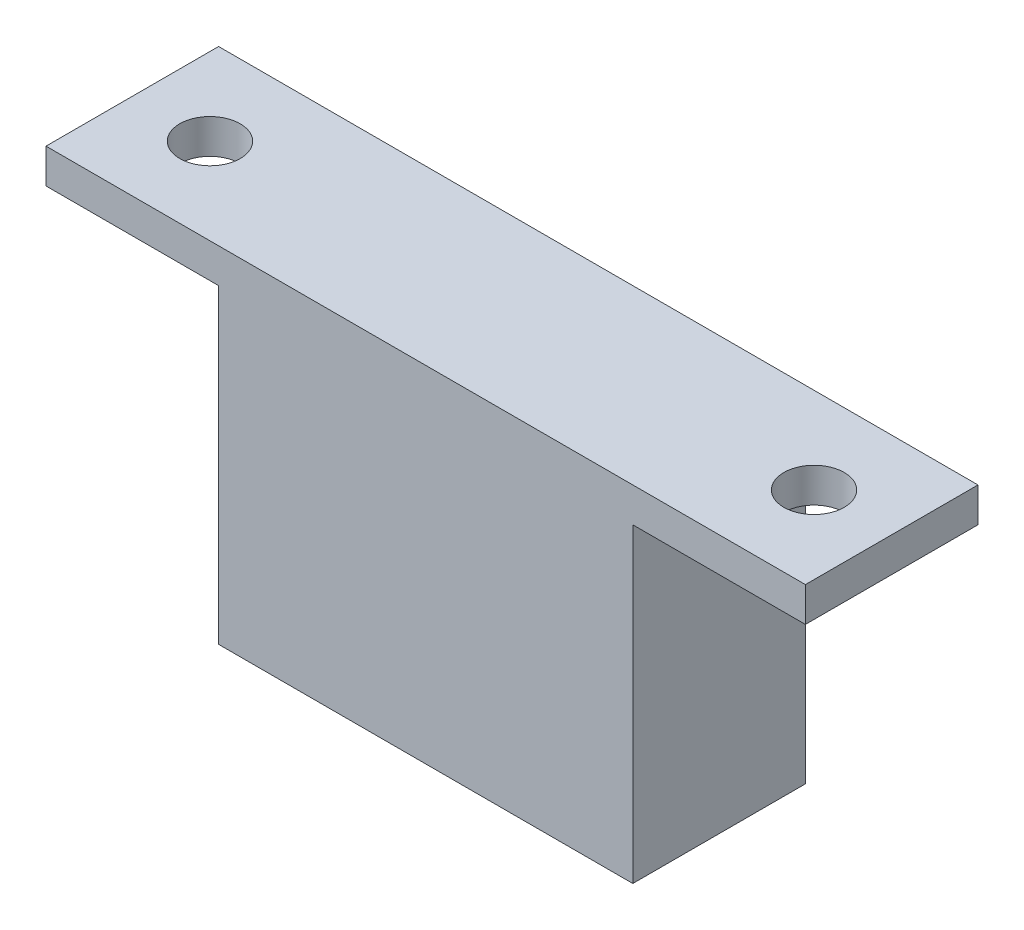
ISO-10303-21;
HEADER;
FILE_DESCRIPTION(('STEP AP214'),'2;1');
FILE_NAME('part.step','',(''),(''),'','','');
FILE_SCHEMA(('AUTOMOTIVE_DESIGN { 1 0 10303 214 1 1 1 1 }'));
ENDSEC;
DATA;
#1=APPLICATION_CONTEXT('core data for automotive mechanical design processes');
#2=APPLICATION_PROTOCOL_DEFINITION('international standard','automotive_design',2000,#1);
#3=PRODUCT_CONTEXT('',#1,'mechanical');
#4=PRODUCT('Part','Part','',(#3));
#5=PRODUCT_RELATED_PRODUCT_CATEGORY('part','',(#4));
#6=PRODUCT_DEFINITION_FORMATION('','',#4);
#7=PRODUCT_DEFINITION_CONTEXT('part definition',#1,'design');
#8=PRODUCT_DEFINITION('design','',#6,#7);
#9=PRODUCT_DEFINITION_SHAPE('','',#8);
#10=(LENGTH_UNIT() NAMED_UNIT(*) SI_UNIT(.MILLI.,.METRE.));
#11=(NAMED_UNIT(*) PLANE_ANGLE_UNIT() SI_UNIT($,.RADIAN.));
#12=(NAMED_UNIT(*) SI_UNIT($,.STERADIAN.) SOLID_ANGLE_UNIT());
#13=UNCERTAINTY_MEASURE_WITH_UNIT(LENGTH_MEASURE(1.E-05),#10,'distance_accuracy_value','');
#14=(GEOMETRIC_REPRESENTATION_CONTEXT(3) GLOBAL_UNCERTAINTY_ASSIGNED_CONTEXT((#13)) GLOBAL_UNIT_ASSIGNED_CONTEXT((#10,
#11,#12)) REPRESENTATION_CONTEXT('',''));
#15=CARTESIAN_POINT('',(0.,0.,0.));
#16=DIRECTION('',(0.,0.,1.));
#17=DIRECTION('',(1.,0.,0.));
#18=AXIS2_PLACEMENT_3D('',#15,#16,#17);
#19=CARTESIAN_POINT('',(12.,3.,10.));
#20=DIRECTION('',(-1.,0.,0.));
#21=DIRECTION('',(0.,-1.,0.));
#22=AXIS2_PLACEMENT_3D('',#19,#20,#21);
#23=PLANE('',#22);
#24=DIRECTION('',(0.,1.,0.));
#25=VECTOR('',#24,1.);
#26=CARTESIAN_POINT('',(12.,3.,0.));
#27=LINE('',#26,#25);
#28=CARTESIAN_POINT('',(12.,-15.,0.));
#29=VERTEX_POINT('',#28);
#30=CARTESIAN_POINT('',(12.,3.,0.));
#31=VERTEX_POINT('',#30);
#32=EDGE_CURVE('E130',#29,#31,#27,.T.);
#33=ORIENTED_EDGE('',*,*,#32,.T.);
#34=DIRECTION('',(0.,0.,-1.));
#35=VECTOR('',#34,1.);
#36=CARTESIAN_POINT('',(12.,3.,10.));
#37=LINE('',#36,#35);
#38=CARTESIAN_POINT('',(12.,3.,10.));
#39=VERTEX_POINT('',#38);
#40=EDGE_CURVE('E11',#39,#31,#37,.T.);
#41=ORIENTED_EDGE('',*,*,#40,.F.);
#42=DIRECTION('',(0.,1.,0.));
#43=VECTOR('',#42,1.);
#44=CARTESIAN_POINT('',(12.,3.,10.));
#45=LINE('',#44,#43);
#46=CARTESIAN_POINT('',(12.,-15.,10.));
#47=VERTEX_POINT('',#46);
#48=EDGE_CURVE('E145',#47,#39,#45,.T.);
#49=ORIENTED_EDGE('',*,*,#48,.F.);
#50=DIRECTION('',(0.,0.,-1.));
#51=VECTOR('',#50,1.);
#52=CARTESIAN_POINT('',(12.,-15.,10.));
#53=LINE('',#52,#51);
#54=EDGE_CURVE('E126',#47,#29,#53,.T.);
#55=ORIENTED_EDGE('',*,*,#54,.T.);
#56=EDGE_LOOP('',(#33,#41,#49,#55));
#57=FACE_BOUND('',#56,.T.);
#58=ADVANCED_FACE('F33',(#57),#23,.F.);
#59=CARTESIAN_POINT('',(22.,3.,10.));
#60=DIRECTION('',(0.,1.,0.));
#61=DIRECTION('',(-1.,0.,0.));
#62=AXIS2_PLACEMENT_3D('',#59,#60,#61);
#63=PLANE('',#62);
#64=CARTESIAN_POINT('',(17.5,3.,5.));
#65=DIRECTION('',(0.,1.,0.));
#66=DIRECTION('',(-1.,0.,0.));
#67=AXIS2_PLACEMENT_3D('',#64,#65,#66);
#68=CIRCLE('',#67,1.75);
#69=CARTESIAN_POINT('',(15.75,3.,5.));
#70=VERTEX_POINT('',#69);
#71=EDGE_CURVE('E181',#70,#70,#68,.T.);
#72=ORIENTED_EDGE('',*,*,#71,.T.);
#73=EDGE_LOOP('',(#72));
#74=FACE_BOUND('',#73,.T.);
#75=DIRECTION('',(1.,0.,0.));
#76=VECTOR('',#75,1.);
#77=CARTESIAN_POINT('',(22.,3.,0.));
#78=LINE('',#77,#76);
#79=CARTESIAN_POINT('',(22.,3.,0.));
#80=VERTEX_POINT('',#79);
#81=EDGE_CURVE('E133',#31,#80,#78,.T.);
#82=ORIENTED_EDGE('',*,*,#81,.T.);
#83=DIRECTION('',(0.,0.,-1.));
#84=VECTOR('',#83,1.);
#85=CARTESIAN_POINT('',(22.,3.,10.));
#86=LINE('',#85,#84);
#87=CARTESIAN_POINT('',(22.,3.,10.));
#88=VERTEX_POINT('',#87);
#89=EDGE_CURVE('E42',#88,#80,#86,.T.);
#90=ORIENTED_EDGE('',*,*,#89,.F.);
#91=DIRECTION('',(1.,0.,0.));
#92=VECTOR('',#91,1.);
#93=CARTESIAN_POINT('',(22.,3.,10.));
#94=LINE('',#93,#92);
#95=EDGE_CURVE('E93',#39,#88,#94,.T.);
#96=ORIENTED_EDGE('',*,*,#95,.F.);
#97=ORIENTED_EDGE('',*,*,#40,.T.);
#98=EDGE_LOOP('',(#82,#90,#96,#97));
#99=FACE_BOUND('',#98,.T.);
#100=ADVANCED_FACE('F213',(#74,#99),#63,.F.);
#101=CARTESIAN_POINT('',(22.,5.,10.));
#102=DIRECTION('',(-1.,0.,0.));
#103=DIRECTION('',(0.,0.,1.));
#104=AXIS2_PLACEMENT_3D('',#101,#102,#103);
#105=PLANE('',#104);
#106=DIRECTION('',(0.,1.,0.));
#107=VECTOR('',#106,1.);
#108=CARTESIAN_POINT('',(22.,5.,0.));
#109=LINE('',#108,#107);
#110=CARTESIAN_POINT('',(22.,5.,0.));
#111=VERTEX_POINT('',#110);
#112=EDGE_CURVE('E135',#80,#111,#109,.T.);
#113=ORIENTED_EDGE('',*,*,#112,.T.);
#114=DIRECTION('',(0.,0.,-1.));
#115=VECTOR('',#114,1.);
#116=CARTESIAN_POINT('',(22.,5.,10.));
#117=LINE('',#116,#115);
#118=CARTESIAN_POINT('',(22.,5.,10.));
#119=VERTEX_POINT('',#118);
#120=EDGE_CURVE('E152',#119,#111,#117,.T.);
#121=ORIENTED_EDGE('',*,*,#120,.F.);
#122=DIRECTION('',(0.,1.,0.));
#123=VECTOR('',#122,1.);
#124=CARTESIAN_POINT('',(22.,5.,10.));
#125=LINE('',#124,#123);
#126=EDGE_CURVE('E161',#88,#119,#125,.T.);
#127=ORIENTED_EDGE('',*,*,#126,.F.);
#128=ORIENTED_EDGE('',*,*,#89,.T.);
#129=EDGE_LOOP('',(#113,#121,#127,#128));
#130=FACE_BOUND('',#129,.T.);
#131=ADVANCED_FACE('F159',(#130),#105,.F.);
#132=CARTESIAN_POINT('',(-12.,5.,10.));
#133=DIRECTION('',(0.,-1.,0.));
#134=DIRECTION('',(1.,0.,0.));
#135=AXIS2_PLACEMENT_3D('',#132,#133,#134);
#136=PLANE('',#135);
#137=CARTESIAN_POINT('',(17.5,5.00000000000001,5.));
#138=DIRECTION('',(0.,1.,0.));
#139=DIRECTION('',(1.,0.,0.));
#140=AXIS2_PLACEMENT_3D('',#137,#138,#139);
#141=CIRCLE('',#140,1.75);
#142=CARTESIAN_POINT('',(19.25,5.00000000000001,5.));
#143=VERTEX_POINT('',#142);
#144=EDGE_CURVE('E184',#143,#143,#141,.T.);
#145=ORIENTED_EDGE('',*,*,#144,.F.);
#146=EDGE_LOOP('',(#145));
#147=FACE_BOUND('',#146,.T.);
#148=CARTESIAN_POINT('',(-17.5,5.,5.));
#149=DIRECTION('',(0.,1.,0.));
#150=DIRECTION('',(-1.,0.,0.));
#151=AXIS2_PLACEMENT_3D('',#148,#149,#150);
#152=CIRCLE('',#151,1.75);
#153=CARTESIAN_POINT('',(-19.25,5.,5.));
#154=VERTEX_POINT('',#153);
#155=EDGE_CURVE('E178',#154,#154,#152,.T.);
#156=ORIENTED_EDGE('',*,*,#155,.F.);
#157=EDGE_LOOP('',(#156));
#158=FACE_BOUND('',#157,.T.);
#159=DIRECTION('',(-1.,0.,0.));
#160=VECTOR('',#159,1.);
#161=CARTESIAN_POINT('',(-12.,5.,0.));
#162=LINE('',#161,#160);
#163=CARTESIAN_POINT('',(-22.,5.,0.));
#164=VERTEX_POINT('',#163);
#165=EDGE_CURVE('E138',#111,#164,#162,.T.);
#166=ORIENTED_EDGE('',*,*,#165,.T.);
#167=DIRECTION('',(0.,0.,-1.));
#168=VECTOR('',#167,1.);
#169=CARTESIAN_POINT('',(-22.,5.,10.));
#170=LINE('',#169,#168);
#171=CARTESIAN_POINT('',(-22.,5.,10.));
#172=VERTEX_POINT('',#171);
#173=EDGE_CURVE('E149',#172,#164,#170,.T.);
#174=ORIENTED_EDGE('',*,*,#173,.F.);
#175=DIRECTION('',(-1.,0.,0.));
#176=VECTOR('',#175,1.);
#177=CARTESIAN_POINT('',(12.,5.,10.));
#178=LINE('',#177,#176);
#179=EDGE_CURVE('E172',#119,#172,#178,.T.);
#180=ORIENTED_EDGE('',*,*,#179,.F.);
#181=ORIENTED_EDGE('',*,*,#120,.T.);
#182=EDGE_LOOP('',(#166,#174,#180,#181));
#183=FACE_BOUND('',#182,.T.);
#184=ADVANCED_FACE('F168',(#147,#158,#183),#136,.F.);
#185=CARTESIAN_POINT('',(-22.,5.,10.));
#186=DIRECTION('',(1.,0.,0.));
#187=DIRECTION('',(0.,0.,-1.));
#188=AXIS2_PLACEMENT_3D('',#185,#186,#187);
#189=PLANE('',#188);
#190=DIRECTION('',(0.,-1.,0.));
#191=VECTOR('',#190,1.);
#192=CARTESIAN_POINT('',(-22.,5.,0.));
#193=LINE('',#192,#191);
#194=CARTESIAN_POINT('',(-22.,3.,0.));
#195=VERTEX_POINT('',#194);
#196=EDGE_CURVE('E140',#164,#195,#193,.T.);
#197=ORIENTED_EDGE('',*,*,#196,.T.);
#198=DIRECTION('',(0.,0.,-1.));
#199=VECTOR('',#198,1.);
#200=CARTESIAN_POINT('',(-22.,3.,10.));
#201=LINE('',#200,#199);
#202=CARTESIAN_POINT('',(-22.,3.,10.));
#203=VERTEX_POINT('',#202);
#204=EDGE_CURVE('E121',#203,#195,#201,.T.);
#205=ORIENTED_EDGE('',*,*,#204,.F.);
#206=DIRECTION('',(0.,-1.,0.));
#207=VECTOR('',#206,1.);
#208=CARTESIAN_POINT('',(-22.,5.,10.));
#209=LINE('',#208,#207);
#210=EDGE_CURVE('E112',#172,#203,#209,.T.);
#211=ORIENTED_EDGE('',*,*,#210,.F.);
#212=ORIENTED_EDGE('',*,*,#173,.T.);
#213=EDGE_LOOP('',(#197,#205,#211,#212));
#214=FACE_BOUND('',#213,.T.);
#215=ADVANCED_FACE('F171',(#214),#189,.F.);
#216=CARTESIAN_POINT('',(-22.,3.,10.));
#217=DIRECTION('',(0.,1.,0.));
#218=DIRECTION('',(-1.,0.,0.));
#219=AXIS2_PLACEMENT_3D('',#216,#217,#218);
#220=PLANE('',#219);
#221=CARTESIAN_POINT('',(-17.5,3.,5.));
#222=DIRECTION('',(0.,1.,0.));
#223=DIRECTION('',(-1.,0.,0.));
#224=AXIS2_PLACEMENT_3D('',#221,#222,#223);
#225=CIRCLE('',#224,1.75);
#226=CARTESIAN_POINT('',(-19.25,3.,5.));
#227=VERTEX_POINT('',#226);
#228=EDGE_CURVE('E36',#227,#227,#225,.T.);
#229=ORIENTED_EDGE('',*,*,#228,.T.);
#230=EDGE_LOOP('',(#229));
#231=FACE_BOUND('',#230,.T.);
#232=DIRECTION('',(1.,0.,0.));
#233=VECTOR('',#232,1.);
#234=CARTESIAN_POINT('',(-22.,3.,0.));
#235=LINE('',#234,#233);
#236=CARTESIAN_POINT('',(-12.,3.,0.));
#237=VERTEX_POINT('',#236);
#238=EDGE_CURVE('E120',#195,#237,#235,.T.);
#239=ORIENTED_EDGE('',*,*,#238,.T.);
#240=DIRECTION('',(0.,0.,-1.));
#241=VECTOR('',#240,1.);
#242=CARTESIAN_POINT('',(-12.,3.,10.));
#243=LINE('',#242,#241);
#244=CARTESIAN_POINT('',(-12.,3.,10.));
#245=VERTEX_POINT('',#244);
#246=EDGE_CURVE('E117',#245,#237,#243,.T.);
#247=ORIENTED_EDGE('',*,*,#246,.F.);
#248=DIRECTION('',(1.,0.,0.));
#249=VECTOR('',#248,1.);
#250=CARTESIAN_POINT('',(-22.,3.,10.));
#251=LINE('',#250,#249);
#252=EDGE_CURVE('E106',#203,#245,#251,.T.);
#253=ORIENTED_EDGE('',*,*,#252,.F.);
#254=ORIENTED_EDGE('',*,*,#204,.T.);
#255=EDGE_LOOP('',(#239,#247,#253,#254));
#256=FACE_BOUND('',#255,.T.);
#257=ADVANCED_FACE('F118',(#231,#256),#220,.F.);
#258=CARTESIAN_POINT('',(-12.,3.,10.));
#259=DIRECTION('',(1.,0.,0.));
#260=DIRECTION('',(0.,1.,0.));
#261=AXIS2_PLACEMENT_3D('',#258,#259,#260);
#262=PLANE('',#261);
#263=DIRECTION('',(0.,-1.,0.));
#264=VECTOR('',#263,1.);
#265=CARTESIAN_POINT('',(-12.,3.,0.));
#266=LINE('',#265,#264);
#267=CARTESIAN_POINT('',(-12.,-15.,0.));
#268=VERTEX_POINT('',#267);
#269=EDGE_CURVE('E79',#237,#268,#266,.T.);
#270=ORIENTED_EDGE('',*,*,#269,.T.);
#271=DIRECTION('',(0.,0.,-1.));
#272=VECTOR('',#271,1.);
#273=CARTESIAN_POINT('',(-12.,-15.,10.));
#274=LINE('',#273,#272);
#275=CARTESIAN_POINT('',(-12.,-15.,10.));
#276=VERTEX_POINT('',#275);
#277=EDGE_CURVE('E122',#276,#268,#274,.T.);
#278=ORIENTED_EDGE('',*,*,#277,.F.);
#279=DIRECTION('',(0.,-1.,0.));
#280=VECTOR('',#279,1.);
#281=CARTESIAN_POINT('',(-12.,3.,10.));
#282=LINE('',#281,#280);
#283=EDGE_CURVE('E110',#245,#276,#282,.T.);
#284=ORIENTED_EDGE('',*,*,#283,.F.);
#285=ORIENTED_EDGE('',*,*,#246,.T.);
#286=EDGE_LOOP('',(#270,#278,#284,#285));
#287=FACE_BOUND('',#286,.T.);
#288=ADVANCED_FACE('F124',(#287),#262,.F.);
#289=CARTESIAN_POINT('',(-12.,-15.,10.));
#290=DIRECTION('',(0.,1.,0.));
#291=DIRECTION('',(-1.,0.,0.));
#292=AXIS2_PLACEMENT_3D('',#289,#290,#291);
#293=PLANE('',#292);
#294=DIRECTION('',(1.,0.,0.));
#295=VECTOR('',#294,1.);
#296=CARTESIAN_POINT('',(-12.,-15.,0.));
#297=LINE('',#296,#295);
#298=EDGE_CURVE('E85',#268,#29,#297,.T.);
#299=ORIENTED_EDGE('',*,*,#298,.T.);
#300=ORIENTED_EDGE('',*,*,#54,.F.);
#301=DIRECTION('',(1.,0.,0.));
#302=VECTOR('',#301,1.);
#303=CARTESIAN_POINT('',(-12.,-15.,10.));
#304=LINE('',#303,#302);
#305=EDGE_CURVE('E50',#276,#47,#304,.T.);
#306=ORIENTED_EDGE('',*,*,#305,.F.);
#307=ORIENTED_EDGE('',*,*,#277,.T.);
#308=EDGE_LOOP('',(#299,#300,#306,#307));
#309=FACE_BOUND('',#308,.T.);
#310=ADVANCED_FACE('F209',(#309),#293,.F.);
#311=CARTESIAN_POINT('',(0.,0.,10.));
#312=DIRECTION('',(0.,0.,1.));
#313=DIRECTION('',(1.,0.,0.));
#314=AXIS2_PLACEMENT_3D('',#311,#312,#313);
#315=PLANE('',#314);
#316=ORIENTED_EDGE('',*,*,#48,.T.);
#317=ORIENTED_EDGE('',*,*,#95,.T.);
#318=ORIENTED_EDGE('',*,*,#126,.T.);
#319=ORIENTED_EDGE('',*,*,#179,.T.);
#320=ORIENTED_EDGE('',*,*,#210,.T.);
#321=ORIENTED_EDGE('',*,*,#252,.T.);
#322=ORIENTED_EDGE('',*,*,#283,.T.);
#323=ORIENTED_EDGE('',*,*,#305,.T.);
#324=EDGE_LOOP('',(#316,#317,#318,#319,#320,#321,#322,#323));
#325=FACE_BOUND('',#324,.T.);
#326=ADVANCED_FACE('F108',(#325),#315,.T.);
#327=CARTESIAN_POINT('',(0.,0.,0.));
#328=DIRECTION('',(0.,0.,1.));
#329=DIRECTION('',(1.,0.,0.));
#330=AXIS2_PLACEMENT_3D('',#327,#328,#329);
#331=PLANE('',#330);
#332=ORIENTED_EDGE('',*,*,#32,.F.);
#333=ORIENTED_EDGE('',*,*,#298,.F.);
#334=ORIENTED_EDGE('',*,*,#269,.F.);
#335=ORIENTED_EDGE('',*,*,#238,.F.);
#336=ORIENTED_EDGE('',*,*,#196,.F.);
#337=ORIENTED_EDGE('',*,*,#165,.F.);
#338=ORIENTED_EDGE('',*,*,#112,.F.);
#339=ORIENTED_EDGE('',*,*,#81,.F.);
#340=EDGE_LOOP('',(#332,#333,#334,#335,#336,#337,#338,#339));
#341=FACE_BOUND('',#340,.T.);
#342=ADVANCED_FACE('F164',(#341),#331,.F.);
#343=CARTESIAN_POINT('',(-17.5,-5.,5.));
#344=DIRECTION('',(0.,1.,0.));
#345=DIRECTION('',(-1.,0.,0.));
#346=AXIS2_PLACEMENT_3D('',#343,#344,#345);
#347=CYLINDRICAL_SURFACE('',#346,1.75);
#348=ORIENTED_EDGE('',*,*,#155,.T.);
#349=EDGE_LOOP('',(#348));
#350=FACE_BOUND('',#349,.T.);
#351=ORIENTED_EDGE('',*,*,#228,.F.);
#352=EDGE_LOOP('',(#351));
#353=FACE_BOUND('',#352,.T.);
#354=ADVANCED_FACE('F196',(#350,#353),#347,.F.);
#355=CARTESIAN_POINT('',(17.5,-4.99999999999999,5.));
#356=DIRECTION('',(0.,1.,0.));
#357=DIRECTION('',(-1.,0.,0.));
#358=AXIS2_PLACEMENT_3D('',#355,#356,#357);
#359=CYLINDRICAL_SURFACE('',#358,1.75);
#360=ORIENTED_EDGE('',*,*,#144,.T.);
#361=EDGE_LOOP('',(#360));
#362=FACE_BOUND('',#361,.T.);
#363=ORIENTED_EDGE('',*,*,#71,.F.);
#364=EDGE_LOOP('',(#363));
#365=FACE_BOUND('',#364,.T.);
#366=ADVANCED_FACE('F188',(#362,#365),#359,.F.);
#367=CLOSED_SHELL('',(#58,#100,#131,#184,#215,#257,#288,#310,#326,#342,#354,#366));
#368=MANIFOLD_SOLID_BREP('B2',#367);
#369=ADVANCED_BREP_SHAPE_REPRESENTATION('',(#18,#368),#14);
#370=SHAPE_DEFINITION_REPRESENTATION(#9,#369);
ENDSEC;
END-ISO-10303-21;
